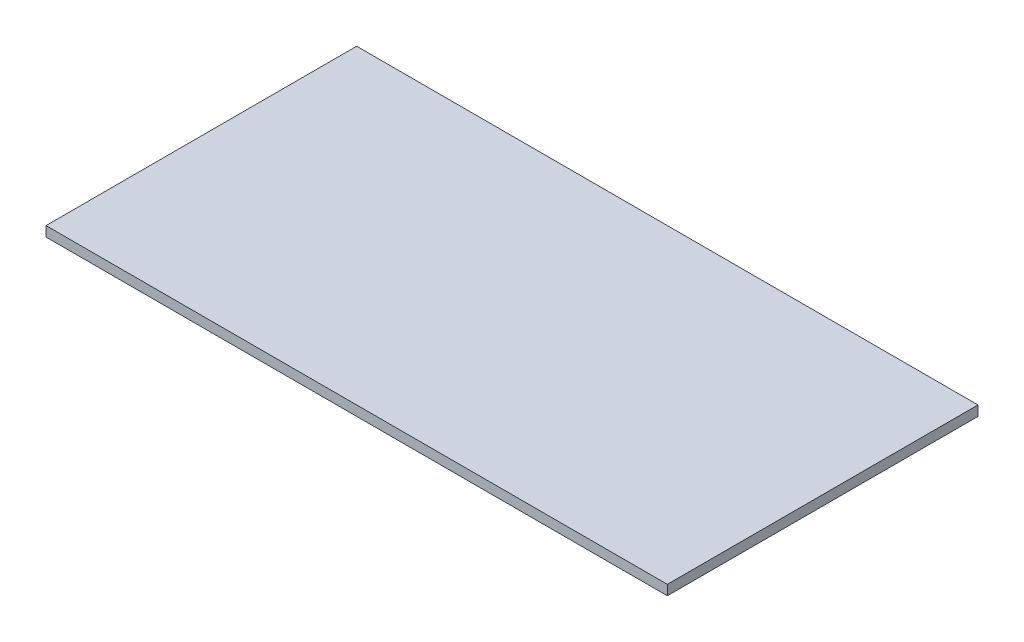
ISO-10303-21;
HEADER;
FILE_DESCRIPTION(('STEP AP214'),'2;1');
FILE_NAME('part.step','',(''),(''),'','','');
FILE_SCHEMA(('AUTOMOTIVE_DESIGN { 1 0 10303 214 1 1 1 1 }'));
ENDSEC;
DATA;
#1=APPLICATION_CONTEXT('core data for automotive mechanical design processes');
#2=APPLICATION_PROTOCOL_DEFINITION('international standard','automotive_design',2000,#1);
#3=PRODUCT_CONTEXT('',#1,'mechanical');
#4=PRODUCT('Part','Part','',(#3));
#5=PRODUCT_RELATED_PRODUCT_CATEGORY('part','',(#4));
#6=PRODUCT_DEFINITION_FORMATION('','',#4);
#7=PRODUCT_DEFINITION_CONTEXT('part definition',#1,'design');
#8=PRODUCT_DEFINITION('design','',#6,#7);
#9=PRODUCT_DEFINITION_SHAPE('','',#8);
#10=(LENGTH_UNIT() NAMED_UNIT(*) SI_UNIT(.MILLI.,.METRE.));
#11=(NAMED_UNIT(*) PLANE_ANGLE_UNIT() SI_UNIT($,.RADIAN.));
#12=(NAMED_UNIT(*) SI_UNIT($,.STERADIAN.) SOLID_ANGLE_UNIT());
#13=UNCERTAINTY_MEASURE_WITH_UNIT(LENGTH_MEASURE(1.E-05),#10,'distance_accuracy_value','');
#14=(GEOMETRIC_REPRESENTATION_CONTEXT(3) GLOBAL_UNCERTAINTY_ASSIGNED_CONTEXT((#13)) GLOBAL_UNIT_ASSIGNED_CONTEXT((#10,
#11,#12)) REPRESENTATION_CONTEXT('',''));
#15=CARTESIAN_POINT('',(0.,0.,0.));
#16=DIRECTION('',(0.,0.,1.));
#17=DIRECTION('',(1.,0.,0.));
#18=AXIS2_PLACEMENT_3D('',#15,#16,#17);
#19=CARTESIAN_POINT('',(0.,1.6,0.));
#20=DIRECTION('',(1.,0.,0.));
#21=DIRECTION('',(0.,0.,-1.));
#22=AXIS2_PLACEMENT_3D('',#19,#20,#21);
#23=PLANE('',#22);
#24=DIRECTION('',(0.,0.,1.));
#25=VECTOR('',#24,1.);
#26=CARTESIAN_POINT('',(0.,0.,0.));
#27=LINE('',#26,#25);
#28=CARTESIAN_POINT('',(0.,0.,-50.));
#29=VERTEX_POINT('',#28);
#30=CARTESIAN_POINT('',(0.,0.,0.));
#31=VERTEX_POINT('',#30);
#32=EDGE_CURVE('E96',#29,#31,#27,.T.);
#33=ORIENTED_EDGE('',*,*,#32,.T.);
#34=DIRECTION('',(0.,-1.,0.));
#35=VECTOR('',#34,1.);
#36=CARTESIAN_POINT('',(0.,1.6,0.));
#37=LINE('',#36,#35);
#38=CARTESIAN_POINT('',(0.,1.6,0.));
#39=VERTEX_POINT('',#38);
#40=EDGE_CURVE('E11',#39,#31,#37,.T.);
#41=ORIENTED_EDGE('',*,*,#40,.F.);
#42=DIRECTION('',(0.,0.,1.));
#43=VECTOR('',#42,1.);
#44=CARTESIAN_POINT('',(0.,1.6,0.));
#45=LINE('',#44,#43);
#46=CARTESIAN_POINT('',(0.,1.6,-50.));
#47=VERTEX_POINT('',#46);
#48=EDGE_CURVE('E84',#47,#39,#45,.T.);
#49=ORIENTED_EDGE('',*,*,#48,.F.);
#50=DIRECTION('',(0.,-1.,0.));
#51=VECTOR('',#50,1.);
#52=CARTESIAN_POINT('',(0.,1.6,-50.));
#53=LINE('',#52,#51);
#54=EDGE_CURVE('E92',#47,#29,#53,.T.);
#55=ORIENTED_EDGE('',*,*,#54,.T.);
#56=EDGE_LOOP('',(#33,#41,#49,#55));
#57=FACE_BOUND('',#56,.T.);
#58=ADVANCED_FACE('F33',(#57),#23,.F.);
#59=CARTESIAN_POINT('',(0.,1.6,0.));
#60=DIRECTION('',(0.,0.,-1.));
#61=DIRECTION('',(-1.,0.,0.));
#62=AXIS2_PLACEMENT_3D('',#59,#60,#61);
#63=PLANE('',#62);
#64=DIRECTION('',(1.,0.,0.));
#65=VECTOR('',#64,1.);
#66=CARTESIAN_POINT('',(0.,0.,0.));
#67=LINE('',#66,#65);
#68=CARTESIAN_POINT('',(100.,0.,0.));
#69=VERTEX_POINT('',#68);
#70=EDGE_CURVE('E88',#31,#69,#67,.T.);
#71=ORIENTED_EDGE('',*,*,#70,.T.);
#72=DIRECTION('',(0.,-1.,0.));
#73=VECTOR('',#72,1.);
#74=CARTESIAN_POINT('',(100.,1.6,0.));
#75=LINE('',#74,#73);
#76=CARTESIAN_POINT('',(100.,1.6,0.));
#77=VERTEX_POINT('',#76);
#78=EDGE_CURVE('E41',#77,#69,#75,.T.);
#79=ORIENTED_EDGE('',*,*,#78,.F.);
#80=DIRECTION('',(1.,0.,0.));
#81=VECTOR('',#80,1.);
#82=CARTESIAN_POINT('',(0.,1.6,0.));
#83=LINE('',#82,#81);
#84=EDGE_CURVE('E79',#39,#77,#83,.T.);
#85=ORIENTED_EDGE('',*,*,#84,.F.);
#86=ORIENTED_EDGE('',*,*,#40,.T.);
#87=EDGE_LOOP('',(#71,#79,#85,#86));
#88=FACE_BOUND('',#87,.T.);
#89=ADVANCED_FACE('F87',(#88),#63,.F.);
#90=CARTESIAN_POINT('',(100.,1.6,0.));
#91=DIRECTION('',(-1.,0.,0.));
#92=DIRECTION('',(0.,0.,1.));
#93=AXIS2_PLACEMENT_3D('',#90,#91,#92);
#94=PLANE('',#93);
#95=DIRECTION('',(0.,0.,-1.));
#96=VECTOR('',#95,1.);
#97=CARTESIAN_POINT('',(100.,0.,0.));
#98=LINE('',#97,#96);
#99=CARTESIAN_POINT('',(100.,0.,-50.));
#100=VERTEX_POINT('',#99);
#101=EDGE_CURVE('E66',#69,#100,#98,.T.);
#102=ORIENTED_EDGE('',*,*,#101,.T.);
#103=DIRECTION('',(0.,-1.,0.));
#104=VECTOR('',#103,1.);
#105=CARTESIAN_POINT('',(100.,1.6,-50.));
#106=LINE('',#105,#104);
#107=CARTESIAN_POINT('',(100.,1.6,-50.));
#108=VERTEX_POINT('',#107);
#109=EDGE_CURVE('E89',#108,#100,#106,.T.);
#110=ORIENTED_EDGE('',*,*,#109,.F.);
#111=DIRECTION('',(0.,0.,-1.));
#112=VECTOR('',#111,1.);
#113=CARTESIAN_POINT('',(100.,1.6,0.));
#114=LINE('',#113,#112);
#115=EDGE_CURVE('E82',#77,#108,#114,.T.);
#116=ORIENTED_EDGE('',*,*,#115,.F.);
#117=ORIENTED_EDGE('',*,*,#78,.T.);
#118=EDGE_LOOP('',(#102,#110,#116,#117));
#119=FACE_BOUND('',#118,.T.);
#120=ADVANCED_FACE('F90',(#119),#94,.F.);
#121=CARTESIAN_POINT('',(0.,1.6,-50.));
#122=DIRECTION('',(0.,0.,1.));
#123=DIRECTION('',(1.,0.,0.));
#124=AXIS2_PLACEMENT_3D('',#121,#122,#123);
#125=PLANE('',#124);
#126=DIRECTION('',(-1.,0.,0.));
#127=VECTOR('',#126,1.);
#128=CARTESIAN_POINT('',(0.,0.,-50.));
#129=LINE('',#128,#127);
#130=EDGE_CURVE('E72',#100,#29,#129,.T.);
#131=ORIENTED_EDGE('',*,*,#130,.T.);
#132=ORIENTED_EDGE('',*,*,#54,.F.);
#133=DIRECTION('',(-1.,0.,0.));
#134=VECTOR('',#133,1.);
#135=CARTESIAN_POINT('',(0.,1.6,-50.));
#136=LINE('',#135,#134);
#137=EDGE_CURVE('E49',#108,#47,#136,.T.);
#138=ORIENTED_EDGE('',*,*,#137,.F.);
#139=ORIENTED_EDGE('',*,*,#109,.T.);
#140=EDGE_LOOP('',(#131,#132,#138,#139));
#141=FACE_BOUND('',#140,.T.);
#142=ADVANCED_FACE('F103',(#141),#125,.F.);
#143=CARTESIAN_POINT('',(0.,1.6,0.));
#144=DIRECTION('',(0.,-1.,0.));
#145=DIRECTION('',(0.,0.,-1.));
#146=AXIS2_PLACEMENT_3D('',#143,#144,#145);
#147=PLANE('',#146);
#148=ORIENTED_EDGE('',*,*,#48,.T.);
#149=ORIENTED_EDGE('',*,*,#84,.T.);
#150=ORIENTED_EDGE('',*,*,#115,.T.);
#151=ORIENTED_EDGE('',*,*,#137,.T.);
#152=EDGE_LOOP('',(#148,#149,#150,#151));
#153=FACE_BOUND('',#152,.T.);
#154=ADVANCED_FACE('F80',(#153),#147,.F.);
#155=CARTESIAN_POINT('',(0.,0.,0.));
#156=DIRECTION('',(0.,-1.,0.));
#157=DIRECTION('',(0.,0.,-1.));
#158=AXIS2_PLACEMENT_3D('',#155,#156,#157);
#159=PLANE('',#158);
#160=ORIENTED_EDGE('',*,*,#32,.F.);
#161=ORIENTED_EDGE('',*,*,#130,.F.);
#162=ORIENTED_EDGE('',*,*,#101,.F.);
#163=ORIENTED_EDGE('',*,*,#70,.F.);
#164=EDGE_LOOP('',(#160,#161,#162,#163));
#165=FACE_BOUND('',#164,.T.);
#166=ADVANCED_FACE('F106',(#165),#159,.T.);
#167=CLOSED_SHELL('',(#58,#89,#120,#142,#154,#166));
#168=MANIFOLD_SOLID_BREP('B2',#167);
#169=ADVANCED_BREP_SHAPE_REPRESENTATION('',(#18,#168),#14);
#170=SHAPE_DEFINITION_REPRESENTATION(#9,#169);
ENDSEC;
END-ISO-10303-21;
